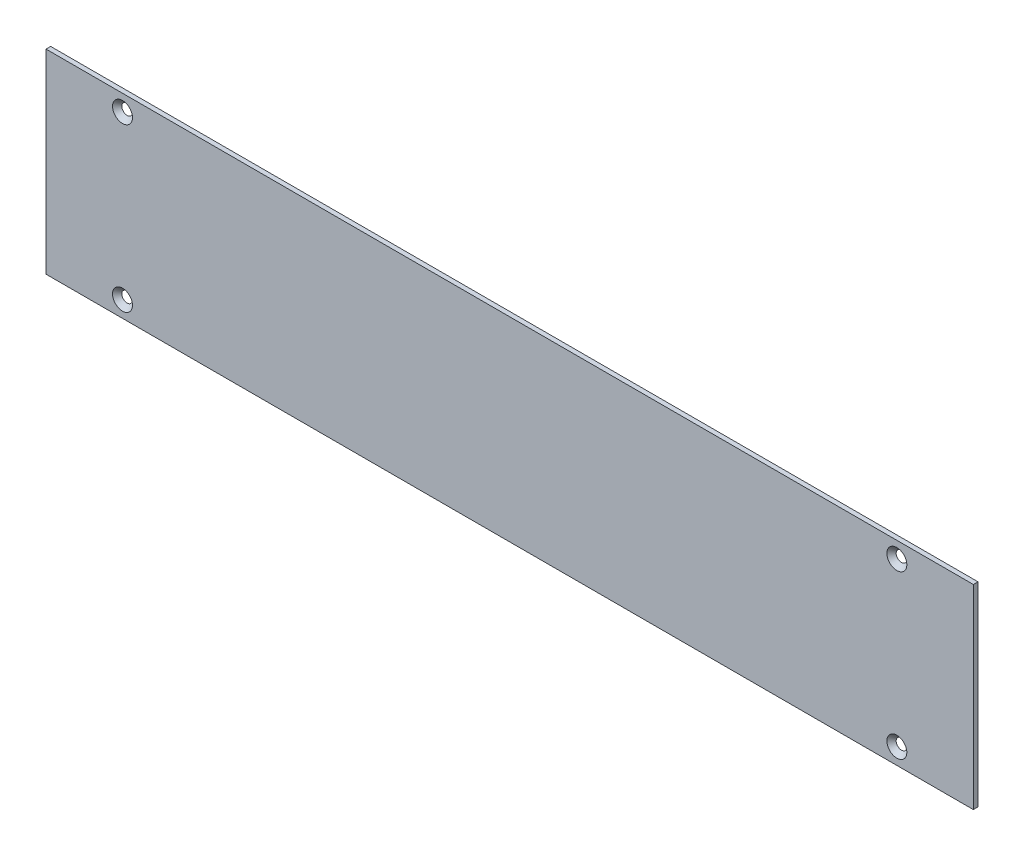
ISO-10303-21;
HEADER;
FILE_DESCRIPTION(('STEP AP214'),'2;1');
FILE_NAME('part.step','',(''),(''),'','','');
FILE_SCHEMA(('AUTOMOTIVE_DESIGN { 1 0 10303 214 1 1 1 1 }'));
ENDSEC;
DATA;
#1=APPLICATION_CONTEXT('core data for automotive mechanical design processes');
#2=APPLICATION_PROTOCOL_DEFINITION('international standard','automotive_design',2000,#1);
#3=PRODUCT_CONTEXT('',#1,'mechanical');
#4=PRODUCT('Part','Part','',(#3));
#5=PRODUCT_RELATED_PRODUCT_CATEGORY('part','',(#4));
#6=PRODUCT_DEFINITION_FORMATION('','',#4);
#7=PRODUCT_DEFINITION_CONTEXT('part definition',#1,'design');
#8=PRODUCT_DEFINITION('design','',#6,#7);
#9=PRODUCT_DEFINITION_SHAPE('','',#8);
#10=(LENGTH_UNIT() NAMED_UNIT(*) SI_UNIT(.MILLI.,.METRE.));
#11=(NAMED_UNIT(*) PLANE_ANGLE_UNIT() SI_UNIT($,.RADIAN.));
#12=(NAMED_UNIT(*) SI_UNIT($,.STERADIAN.) SOLID_ANGLE_UNIT());
#13=UNCERTAINTY_MEASURE_WITH_UNIT(LENGTH_MEASURE(1.E-05),#10,'distance_accuracy_value','');
#14=(GEOMETRIC_REPRESENTATION_CONTEXT(3) GLOBAL_UNCERTAINTY_ASSIGNED_CONTEXT((#13)) GLOBAL_UNIT_ASSIGNED_CONTEXT((#10,
#11,#12)) REPRESENTATION_CONTEXT('',''));
#15=CARTESIAN_POINT('',(0.,0.,0.));
#16=DIRECTION('',(0.,0.,1.));
#17=DIRECTION('',(1.,0.,0.));
#18=AXIS2_PLACEMENT_3D('',#15,#16,#17);
#19=CARTESIAN_POINT('',(0.,0.,2.));
#20=DIRECTION('',(1.,0.,0.));
#21=DIRECTION('',(0.,0.,-1.));
#22=AXIS2_PLACEMENT_3D('',#19,#20,#21);
#23=PLANE('',#22);
#24=DIRECTION('',(0.,-1.,0.));
#25=VECTOR('',#24,1.);
#26=CARTESIAN_POINT('',(0.,0.,0.));
#27=LINE('',#26,#25);
#28=CARTESIAN_POINT('',(0.,84.1,0.));
#29=VERTEX_POINT('',#28);
#30=CARTESIAN_POINT('',(0.,0.,0.));
#31=VERTEX_POINT('',#30);
#32=EDGE_CURVE('E101',#29,#31,#27,.T.);
#33=ORIENTED_EDGE('',*,*,#32,.T.);
#34=DIRECTION('',(0.,0.,-1.));
#35=VECTOR('',#34,1.);
#36=CARTESIAN_POINT('',(0.,0.,2.));
#37=LINE('',#36,#35);
#38=CARTESIAN_POINT('',(0.,0.,2.));
#39=VERTEX_POINT('',#38);
#40=EDGE_CURVE('E92',#39,#31,#37,.T.);
#41=ORIENTED_EDGE('',*,*,#40,.F.);
#42=DIRECTION('',(0.,-1.,0.));
#43=VECTOR('',#42,1.);
#44=CARTESIAN_POINT('',(0.,0.,2.));
#45=LINE('',#44,#43);
#46=CARTESIAN_POINT('',(0.,84.1,2.));
#47=VERTEX_POINT('',#46);
#48=EDGE_CURVE('E86',#47,#39,#45,.T.);
#49=ORIENTED_EDGE('',*,*,#48,.F.);
#50=DIRECTION('',(0.,0.,-1.));
#51=VECTOR('',#50,1.);
#52=CARTESIAN_POINT('',(0.,84.1,2.));
#53=LINE('',#52,#51);
#54=EDGE_CURVE('E97',#47,#29,#53,.T.);
#55=ORIENTED_EDGE('',*,*,#54,.T.);
#56=EDGE_LOOP('',(#33,#41,#49,#55));
#57=FACE_BOUND('',#56,.T.);
#58=ADVANCED_FACE('F33',(#57),#23,.F.);
#59=CARTESIAN_POINT('',(0.,0.,2.));
#60=DIRECTION('',(0.,1.,0.));
#61=DIRECTION('',(0.,0.,1.));
#62=AXIS2_PLACEMENT_3D('',#59,#60,#61);
#63=PLANE('',#62);
#64=DIRECTION('',(1.,0.,0.));
#65=VECTOR('',#64,1.);
#66=CARTESIAN_POINT('',(0.,0.,0.));
#67=LINE('',#66,#65);
#68=CARTESIAN_POINT('',(400.,0.,0.));
#69=VERTEX_POINT('',#68);
#70=EDGE_CURVE('E91',#31,#69,#67,.T.);
#71=ORIENTED_EDGE('',*,*,#70,.T.);
#72=DIRECTION('',(0.,0.,-1.));
#73=VECTOR('',#72,1.);
#74=CARTESIAN_POINT('',(400.,0.,2.));
#75=LINE('',#74,#73);
#76=CARTESIAN_POINT('',(400.,0.,2.));
#77=VERTEX_POINT('',#76);
#78=EDGE_CURVE('E89',#77,#69,#75,.T.);
#79=ORIENTED_EDGE('',*,*,#78,.F.);
#80=DIRECTION('',(1.,0.,0.));
#81=VECTOR('',#80,1.);
#82=CARTESIAN_POINT('',(0.,0.,2.));
#83=LINE('',#82,#81);
#84=EDGE_CURVE('E81',#39,#77,#83,.T.);
#85=ORIENTED_EDGE('',*,*,#84,.F.);
#86=ORIENTED_EDGE('',*,*,#40,.T.);
#87=EDGE_LOOP('',(#71,#79,#85,#86));
#88=FACE_BOUND('',#87,.T.);
#89=ADVANCED_FACE('F90',(#88),#63,.F.);
#90=CARTESIAN_POINT('',(400.,0.,2.));
#91=DIRECTION('',(-1.,0.,0.));
#92=DIRECTION('',(0.,0.,1.));
#93=AXIS2_PLACEMENT_3D('',#90,#91,#92);
#94=PLANE('',#93);
#95=DIRECTION('',(0.,1.,0.));
#96=VECTOR('',#95,1.);
#97=CARTESIAN_POINT('',(400.,0.,0.));
#98=LINE('',#97,#96);
#99=CARTESIAN_POINT('',(400.,84.1,0.));
#100=VERTEX_POINT('',#99);
#101=EDGE_CURVE('E67',#69,#100,#98,.T.);
#102=ORIENTED_EDGE('',*,*,#101,.T.);
#103=DIRECTION('',(0.,0.,-1.));
#104=VECTOR('',#103,1.);
#105=CARTESIAN_POINT('',(400.,84.1,2.));
#106=LINE('',#105,#104);
#107=CARTESIAN_POINT('',(400.,84.1,2.));
#108=VERTEX_POINT('',#107);
#109=EDGE_CURVE('E93',#108,#100,#106,.T.);
#110=ORIENTED_EDGE('',*,*,#109,.F.);
#111=DIRECTION('',(0.,1.,0.));
#112=VECTOR('',#111,1.);
#113=CARTESIAN_POINT('',(400.,0.,2.));
#114=LINE('',#113,#112);
#115=EDGE_CURVE('E84',#77,#108,#114,.T.);
#116=ORIENTED_EDGE('',*,*,#115,.F.);
#117=ORIENTED_EDGE('',*,*,#78,.T.);
#118=EDGE_LOOP('',(#102,#110,#116,#117));
#119=FACE_BOUND('',#118,.T.);
#120=ADVANCED_FACE('F95',(#119),#94,.F.);
#121=CARTESIAN_POINT('',(0.,84.1,2.));
#122=DIRECTION('',(0.,-1.,0.));
#123=DIRECTION('',(0.,0.,-1.));
#124=AXIS2_PLACEMENT_3D('',#121,#122,#123);
#125=PLANE('',#124);
#126=DIRECTION('',(-1.,0.,0.));
#127=VECTOR('',#126,1.);
#128=CARTESIAN_POINT('',(0.,84.1,0.));
#129=LINE('',#128,#127);
#130=EDGE_CURVE('E73',#100,#29,#129,.T.);
#131=ORIENTED_EDGE('',*,*,#130,.T.);
#132=ORIENTED_EDGE('',*,*,#54,.F.);
#133=DIRECTION('',(-1.,0.,0.));
#134=VECTOR('',#133,1.);
#135=CARTESIAN_POINT('',(0.,84.1,2.));
#136=LINE('',#135,#134);
#137=EDGE_CURVE('E50',#108,#47,#136,.T.);
#138=ORIENTED_EDGE('',*,*,#137,.F.);
#139=ORIENTED_EDGE('',*,*,#109,.T.);
#140=EDGE_LOOP('',(#131,#132,#138,#139));
#141=FACE_BOUND('',#140,.T.);
#142=ADVANCED_FACE('F151',(#141),#125,.F.);
#143=CARTESIAN_POINT('',(0.,0.,2.));
#144=DIRECTION('',(0.,0.,-1.));
#145=DIRECTION('',(-1.,0.,0.));
#146=AXIS2_PLACEMENT_3D('',#143,#144,#145);
#147=PLANE('',#146);
#148=CARTESIAN_POINT('',(367.000000000001,6.99999999999999,2.));
#149=DIRECTION('',(0.,0.,-1.));
#150=DIRECTION('',(-1.,0.,0.));
#151=AXIS2_PLACEMENT_3D('',#148,#149,#150);
#152=CIRCLE('',#151,4.29999999999997);
#153=CARTESIAN_POINT('',(362.700000000001,6.99999999999999,2.));
#154=VERTEX_POINT('',#153);
#155=EDGE_CURVE('E11',#154,#154,#152,.T.);
#156=ORIENTED_EDGE('',*,*,#155,.T.);
#157=EDGE_LOOP('',(#156));
#158=FACE_BOUND('',#157,.T.);
#159=CARTESIAN_POINT('',(367.,77.1,2.));
#160=DIRECTION('',(0.,0.,-1.));
#161=DIRECTION('',(-1.,0.,0.));
#162=AXIS2_PLACEMENT_3D('',#159,#160,#161);
#163=CIRCLE('',#162,4.29999999999997);
#164=CARTESIAN_POINT('',(362.7,77.1,2.));
#165=VERTEX_POINT('',#164);
#166=EDGE_CURVE('E42',#165,#165,#163,.T.);
#167=ORIENTED_EDGE('',*,*,#166,.T.);
#168=EDGE_LOOP('',(#167));
#169=FACE_BOUND('',#168,.T.);
#170=CARTESIAN_POINT('',(33.0000000000006,7.,2.));
#171=DIRECTION('',(0.,0.,-1.));
#172=DIRECTION('',(-1.,0.,0.));
#173=AXIS2_PLACEMENT_3D('',#170,#171,#172);
#174=CIRCLE('',#173,4.30000000000002);
#175=CARTESIAN_POINT('',(28.7000000000006,7.,2.));
#176=VERTEX_POINT('',#175);
#177=EDGE_CURVE('E125',#176,#176,#174,.T.);
#178=ORIENTED_EDGE('',*,*,#177,.T.);
#179=EDGE_LOOP('',(#178));
#180=FACE_BOUND('',#179,.T.);
#181=CARTESIAN_POINT('',(33.,77.1,2.));
#182=DIRECTION('',(0.,0.,-1.));
#183=DIRECTION('',(-1.,0.,0.));
#184=AXIS2_PLACEMENT_3D('',#181,#182,#183);
#185=CIRCLE('',#184,4.30000000000002);
#186=CARTESIAN_POINT('',(28.7,77.1,2.));
#187=VERTEX_POINT('',#186);
#188=EDGE_CURVE('E122',#187,#187,#185,.T.);
#189=ORIENTED_EDGE('',*,*,#188,.T.);
#190=EDGE_LOOP('',(#189));
#191=FACE_BOUND('',#190,.T.);
#192=ORIENTED_EDGE('',*,*,#48,.T.);
#193=ORIENTED_EDGE('',*,*,#84,.T.);
#194=ORIENTED_EDGE('',*,*,#115,.T.);
#195=ORIENTED_EDGE('',*,*,#137,.T.);
#196=EDGE_LOOP('',(#192,#193,#194,#195));
#197=FACE_BOUND('',#196,.T.);
#198=ADVANCED_FACE('F82',(#158,#169,#180,#191,#197),#147,.F.);
#199=CARTESIAN_POINT('',(0.,0.,0.));
#200=DIRECTION('',(0.,0.,-1.));
#201=DIRECTION('',(-1.,0.,0.));
#202=AXIS2_PLACEMENT_3D('',#199,#200,#201);
#203=PLANE('',#202);
#204=CARTESIAN_POINT('',(367.000000000001,6.99999999999999,0.));
#205=DIRECTION('',(0.,0.,-1.));
#206=DIRECTION('',(-1.,0.,0.));
#207=AXIS2_PLACEMENT_3D('',#204,#205,#206);
#208=CIRCLE('',#207,2.29999999999999);
#209=CARTESIAN_POINT('',(364.700000000001,6.99999999999999,0.));
#210=VERTEX_POINT('',#209);
#211=EDGE_CURVE('E119',#210,#210,#208,.F.);
#212=ORIENTED_EDGE('',*,*,#211,.T.);
#213=EDGE_LOOP('',(#212));
#214=FACE_BOUND('',#213,.T.);
#215=CARTESIAN_POINT('',(367.,77.1,0.));
#216=DIRECTION('',(0.,0.,-1.));
#217=DIRECTION('',(-1.,0.,0.));
#218=AXIS2_PLACEMENT_3D('',#215,#216,#217);
#219=CIRCLE('',#218,2.29999999999999);
#220=CARTESIAN_POINT('',(364.7,77.1,0.));
#221=VERTEX_POINT('',#220);
#222=EDGE_CURVE('E116',#221,#221,#219,.F.);
#223=ORIENTED_EDGE('',*,*,#222,.T.);
#224=EDGE_LOOP('',(#223));
#225=FACE_BOUND('',#224,.T.);
#226=CARTESIAN_POINT('',(33.0000000000006,7.,0.));
#227=DIRECTION('',(0.,0.,-1.));
#228=DIRECTION('',(-1.,0.,0.));
#229=AXIS2_PLACEMENT_3D('',#226,#227,#228);
#230=CIRCLE('',#229,2.30000000000004);
#231=CARTESIAN_POINT('',(30.7000000000006,7.,0.));
#232=VERTEX_POINT('',#231);
#233=EDGE_CURVE('E113',#232,#232,#230,.F.);
#234=ORIENTED_EDGE('',*,*,#233,.T.);
#235=EDGE_LOOP('',(#234));
#236=FACE_BOUND('',#235,.T.);
#237=CARTESIAN_POINT('',(33.,77.1,0.));
#238=DIRECTION('',(0.,0.,-1.));
#239=DIRECTION('',(-1.,0.,0.));
#240=AXIS2_PLACEMENT_3D('',#237,#238,#239);
#241=CIRCLE('',#240,2.30000000000004);
#242=CARTESIAN_POINT('',(30.7,77.1,0.));
#243=VERTEX_POINT('',#242);
#244=EDGE_CURVE('E110',#243,#243,#241,.F.);
#245=ORIENTED_EDGE('',*,*,#244,.T.);
#246=EDGE_LOOP('',(#245));
#247=FACE_BOUND('',#246,.T.);
#248=ORIENTED_EDGE('',*,*,#32,.F.);
#249=ORIENTED_EDGE('',*,*,#130,.F.);
#250=ORIENTED_EDGE('',*,*,#101,.F.);
#251=ORIENTED_EDGE('',*,*,#70,.F.);
#252=EDGE_LOOP('',(#248,#249,#250,#251));
#253=FACE_BOUND('',#252,.T.);
#254=ADVANCED_FACE('F140',(#214,#225,#236,#247,#253),#203,.T.);
#255=CARTESIAN_POINT('',(367.000000000001,6.99999999999999,-0.0500000000000357));
#256=DIRECTION('',(0.,0.,1.));
#257=DIRECTION('',(1.,0.,0.));
#258=AXIS2_PLACEMENT_3D('',#255,#256,#257);
#259=CONICAL_SURFACE('',#258,2.24999999999995,0.785398163397444);
#260=ORIENTED_EDGE('',*,*,#155,.F.);
#261=EDGE_LOOP('',(#260));
#262=FACE_BOUND('',#261,.T.);
#263=ORIENTED_EDGE('',*,*,#211,.F.);
#264=EDGE_LOOP('',(#263));
#265=FACE_BOUND('',#264,.T.);
#266=ADVANCED_FACE('F136',(#262,#265),#259,.F.);
#267=CARTESIAN_POINT('',(367.,77.1,-0.0500000000000357));
#268=DIRECTION('',(0.,0.,1.));
#269=DIRECTION('',(1.,0.,0.));
#270=AXIS2_PLACEMENT_3D('',#267,#268,#269);
#271=CONICAL_SURFACE('',#270,2.24999999999995,0.785398163397444);
#272=ORIENTED_EDGE('',*,*,#166,.F.);
#273=EDGE_LOOP('',(#272));
#274=FACE_BOUND('',#273,.T.);
#275=ORIENTED_EDGE('',*,*,#222,.F.);
#276=EDGE_LOOP('',(#275));
#277=FACE_BOUND('',#276,.T.);
#278=ADVANCED_FACE('F132',(#274,#277),#271,.F.);
#279=CARTESIAN_POINT('',(33.0000000000006,7.,-0.0500000000000357));
#280=DIRECTION('',(0.,0.,1.));
#281=DIRECTION('',(1.,0.,0.));
#282=AXIS2_PLACEMENT_3D('',#279,#280,#281);
#283=CONICAL_SURFACE('',#282,2.25,0.785398163397444);
#284=ORIENTED_EDGE('',*,*,#177,.F.);
#285=EDGE_LOOP('',(#284));
#286=FACE_BOUND('',#285,.T.);
#287=ORIENTED_EDGE('',*,*,#233,.F.);
#288=EDGE_LOOP('',(#287));
#289=FACE_BOUND('',#288,.T.);
#290=ADVANCED_FACE('F135',(#286,#289),#283,.F.);
#291=CARTESIAN_POINT('',(33.,77.1,-0.0500000000000357));
#292=DIRECTION('',(0.,0.,1.));
#293=DIRECTION('',(1.,0.,0.));
#294=AXIS2_PLACEMENT_3D('',#291,#292,#293);
#295=CONICAL_SURFACE('',#294,2.25,0.785398163397444);
#296=ORIENTED_EDGE('',*,*,#188,.F.);
#297=EDGE_LOOP('',(#296));
#298=FACE_BOUND('',#297,.T.);
#299=ORIENTED_EDGE('',*,*,#244,.F.);
#300=EDGE_LOOP('',(#299));
#301=FACE_BOUND('',#300,.T.);
#302=ADVANCED_FACE('F35',(#298,#301),#295,.F.);
#303=CLOSED_SHELL('',(#58,#89,#120,#142,#198,#254,#266,#278,#290,#302));
#304=MANIFOLD_SOLID_BREP('B2',#303);
#305=ADVANCED_BREP_SHAPE_REPRESENTATION('',(#18,#304),#14);
#306=SHAPE_DEFINITION_REPRESENTATION(#9,#305);
ENDSEC;
END-ISO-10303-21;
